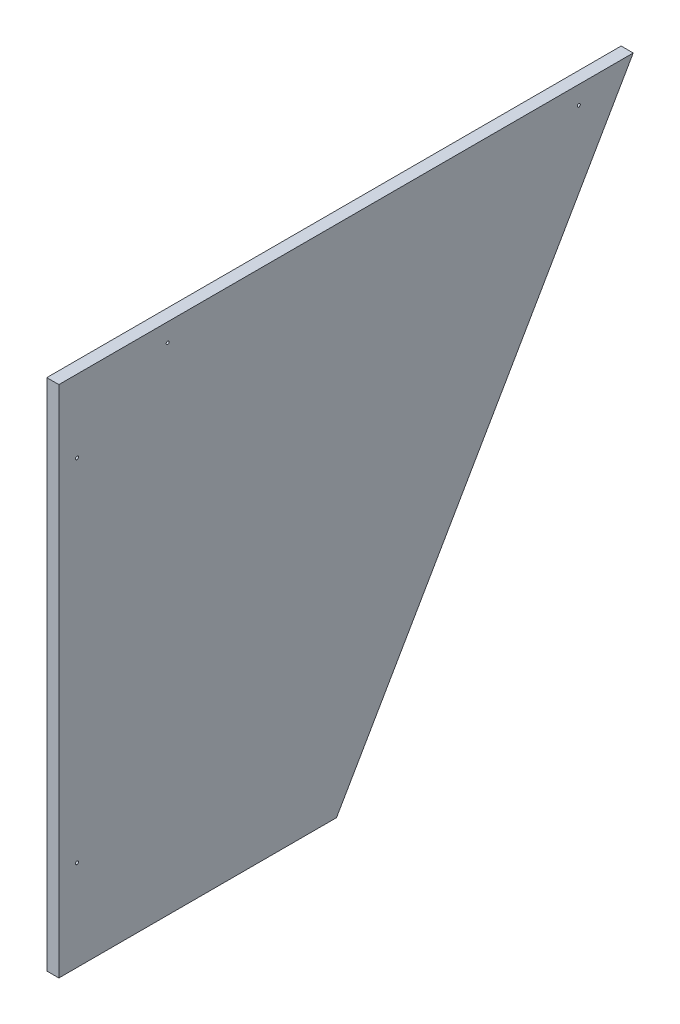
ISO-10303-21;
HEADER;
FILE_DESCRIPTION(('STEP AP214'),'2;1');
FILE_NAME('part.step','',(''),(''),'','','');
FILE_SCHEMA(('AUTOMOTIVE_DESIGN { 1 0 10303 214 1 1 1 1 }'));
ENDSEC;
DATA;
#1=APPLICATION_CONTEXT('core data for automotive mechanical design processes');
#2=APPLICATION_PROTOCOL_DEFINITION('international standard','automotive_design',2000,#1);
#3=PRODUCT_CONTEXT('',#1,'mechanical');
#4=PRODUCT('Part','Part','',(#3));
#5=PRODUCT_RELATED_PRODUCT_CATEGORY('part','',(#4));
#6=PRODUCT_DEFINITION_FORMATION('','',#4);
#7=PRODUCT_DEFINITION_CONTEXT('part definition',#1,'design');
#8=PRODUCT_DEFINITION('design','',#6,#7);
#9=PRODUCT_DEFINITION_SHAPE('','',#8);
#10=(LENGTH_UNIT() NAMED_UNIT(*) SI_UNIT(.MILLI.,.METRE.));
#11=(NAMED_UNIT(*) PLANE_ANGLE_UNIT() SI_UNIT($,.RADIAN.));
#12=(NAMED_UNIT(*) SI_UNIT($,.STERADIAN.) SOLID_ANGLE_UNIT());
#13=UNCERTAINTY_MEASURE_WITH_UNIT(LENGTH_MEASURE(1.E-05),#10,'distance_accuracy_value','');
#14=(GEOMETRIC_REPRESENTATION_CONTEXT(3) GLOBAL_UNCERTAINTY_ASSIGNED_CONTEXT((#13)) GLOBAL_UNIT_ASSIGNED_CONTEXT((#10,
#11,#12)) REPRESENTATION_CONTEXT('',''));
#15=CARTESIAN_POINT('',(0.,0.,0.));
#16=DIRECTION('',(0.,0.,1.));
#17=DIRECTION('',(1.,0.,0.));
#18=AXIS2_PLACEMENT_3D('',#15,#16,#17);
#19=CARTESIAN_POINT('',(-587.375,0.,0.));
#20=DIRECTION('',(1.,0.,0.));
#21=DIRECTION('',(0.,0.,-1.));
#22=AXIS2_PLACEMENT_3D('',#19,#20,#21);
#23=PLANE('',#22);
#24=CARTESIAN_POINT('',(-587.375,-406.4,1047.75));
#25=DIRECTION('',(-1.,0.,0.));
#26=DIRECTION('',(0.,0.,1.));
#27=AXIS2_PLACEMENT_3D('',#24,#25,#26);
#28=CIRCLE('',#27,1.5875);
#29=CARTESIAN_POINT('',(-587.375,-406.4,1049.3375));
#30=VERTEX_POINT('',#29);
#31=EDGE_CURVE('E91',#30,#30,#28,.T.);
#32=ORIENTED_EDGE('',*,*,#31,.T.);
#33=EDGE_LOOP('',(#32));
#34=FACE_BOUND('',#33,.T.);
#35=CARTESIAN_POINT('',(-587.375,-38.1,1047.75));
#36=DIRECTION('',(-1.,0.,0.));
#37=DIRECTION('',(0.,0.,1.));
#38=AXIS2_PLACEMENT_3D('',#35,#36,#37);
#39=CIRCLE('',#38,1.5875);
#40=CARTESIAN_POINT('',(-587.375,-38.1,1049.3375));
#41=VERTEX_POINT('',#40);
#42=EDGE_CURVE('E94',#41,#41,#39,.T.);
#43=ORIENTED_EDGE('',*,*,#42,.T.);
#44=EDGE_LOOP('',(#43));
#45=FACE_BOUND('',#44,.T.);
#46=CARTESIAN_POINT('',(-587.375,19.05,952.5));
#47=DIRECTION('',(-1.,0.,0.));
#48=DIRECTION('',(0.,0.,1.));
#49=AXIS2_PLACEMENT_3D('',#46,#47,#48);
#50=CIRCLE('',#49,1.5875);
#51=CARTESIAN_POINT('',(-587.375,19.05,954.0875));
#52=VERTEX_POINT('',#51);
#53=EDGE_CURVE('E96',#52,#52,#50,.T.);
#54=ORIENTED_EDGE('',*,*,#53,.T.);
#55=EDGE_LOOP('',(#54));
#56=FACE_BOUND('',#55,.T.);
#57=CARTESIAN_POINT('',(-587.375,19.05,520.7));
#58=DIRECTION('',(-1.,0.,0.));
#59=DIRECTION('',(0.,0.,1.));
#60=AXIS2_PLACEMENT_3D('',#57,#58,#59);
#61=CIRCLE('',#60,1.5875);
#62=CARTESIAN_POINT('',(-587.375,19.05,522.2875));
#63=VERTEX_POINT('',#62);
#64=EDGE_CURVE('E19',#63,#63,#61,.T.);
#65=ORIENTED_EDGE('',*,*,#64,.T.);
#66=EDGE_LOOP('',(#65));
#67=FACE_BOUND('',#66,.T.);
#68=DIRECTION('',(0.,-0.866025403784429,0.500000000000017));
#69=VECTOR('',#68,1.);
#70=CARTESIAN_POINT('',(-587.375,-501.65,775.174807795112));
#71=LINE('',#70,#69);
#72=CARTESIAN_POINT('',(-587.375,-501.65,775.174807795112));
#73=VERTEX_POINT('',#72);
#74=CARTESIAN_POINT('',(-587.375,38.0999999999997,463.549999999999));
#75=VERTEX_POINT('',#74);
#76=EDGE_CURVE('E70',#73,#75,#71,.F.);
#77=ORIENTED_EDGE('',*,*,#76,.T.);
#78=DIRECTION('',(0.,0.,-1.));
#79=VECTOR('',#78,1.);
#80=CARTESIAN_POINT('',(-587.375,38.1,463.55));
#81=LINE('',#80,#79);
#82=CARTESIAN_POINT('',(-587.375,38.1,1066.8));
#83=VERTEX_POINT('',#82);
#84=EDGE_CURVE('E67',#75,#83,#81,.F.);
#85=ORIENTED_EDGE('',*,*,#84,.T.);
#86=DIRECTION('',(0.,1.,0.));
#87=VECTOR('',#86,1.);
#88=CARTESIAN_POINT('',(-587.375,38.1,1066.8));
#89=LINE('',#88,#87);
#90=CARTESIAN_POINT('',(-587.375,-501.65,1066.8));
#91=VERTEX_POINT('',#90);
#92=EDGE_CURVE('E58',#83,#91,#89,.F.);
#93=ORIENTED_EDGE('',*,*,#92,.T.);
#94=DIRECTION('',(0.,0.,1.));
#95=VECTOR('',#94,1.);
#96=CARTESIAN_POINT('',(-587.375,-501.65,1066.8));
#97=LINE('',#96,#95);
#98=EDGE_CURVE('E53',#91,#73,#97,.F.);
#99=ORIENTED_EDGE('',*,*,#98,.T.);
#100=EDGE_LOOP('',(#77,#85,#93,#99));
#101=FACE_BOUND('',#100,.T.);
#102=ADVANCED_FACE('F16',(#34,#45,#56,#67,#101),#23,.T.);
#103=CARTESIAN_POINT('',(-587.375,38.1,463.55));
#104=DIRECTION('',(0.,-1.,0.));
#105=DIRECTION('',(0.,0.,-1.));
#106=AXIS2_PLACEMENT_3D('',#103,#104,#105);
#107=PLANE('',#106);
#108=DIRECTION('',(0.,0.,-1.));
#109=VECTOR('',#108,1.);
#110=CARTESIAN_POINT('',(-600.075,38.1,0.));
#111=LINE('',#110,#109);
#112=CARTESIAN_POINT('',(-600.075,38.0999999999998,463.549999999999));
#113=VERTEX_POINT('',#112);
#114=CARTESIAN_POINT('',(-600.075,38.1,1066.8));
#115=VERTEX_POINT('',#114);
#116=EDGE_CURVE('E77',#113,#115,#111,.F.);
#117=ORIENTED_EDGE('',*,*,#116,.T.);
#118=DIRECTION('',(-1.,0.,0.));
#119=VECTOR('',#118,1.);
#120=CARTESIAN_POINT('',(-587.375,38.1,1066.8));
#121=LINE('',#120,#119);
#122=EDGE_CURVE('E63',#115,#83,#121,.F.);
#123=ORIENTED_EDGE('',*,*,#122,.T.);
#124=ORIENTED_EDGE('',*,*,#84,.F.);
#125=DIRECTION('',(1.,0.,0.));
#126=VECTOR('',#125,1.);
#127=CARTESIAN_POINT('',(-587.375,38.0999999999989,463.549999999998));
#128=LINE('',#127,#126);
#129=EDGE_CURVE('E103',#75,#113,#128,.F.);
#130=ORIENTED_EDGE('',*,*,#129,.T.);
#131=EDGE_LOOP('',(#117,#123,#124,#130));
#132=FACE_BOUND('',#131,.T.);
#133=ADVANCED_FACE('F76',(#132),#107,.F.);
#134=CARTESIAN_POINT('',(-587.375,38.1,1066.8));
#135=DIRECTION('',(0.,0.,-1.));
#136=DIRECTION('',(-1.,0.,0.));
#137=AXIS2_PLACEMENT_3D('',#134,#135,#136);
#138=PLANE('',#137);
#139=DIRECTION('',(0.,1.,0.));
#140=VECTOR('',#139,1.);
#141=CARTESIAN_POINT('',(-600.075,0.,1066.8));
#142=LINE('',#141,#140);
#143=CARTESIAN_POINT('',(-600.075,-501.65,1066.8));
#144=VERTEX_POINT('',#143);
#145=EDGE_CURVE('E110',#115,#144,#142,.F.);
#146=ORIENTED_EDGE('',*,*,#145,.T.);
#147=DIRECTION('',(1.,0.,0.));
#148=VECTOR('',#147,1.);
#149=CARTESIAN_POINT('',(-587.375,-501.65,1066.8));
#150=LINE('',#149,#148);
#151=EDGE_CURVE('E65',#144,#91,#150,.T.);
#152=ORIENTED_EDGE('',*,*,#151,.T.);
#153=ORIENTED_EDGE('',*,*,#92,.F.);
#154=ORIENTED_EDGE('',*,*,#122,.F.);
#155=EDGE_LOOP('',(#146,#152,#153,#154));
#156=FACE_BOUND('',#155,.T.);
#157=ADVANCED_FACE('F61',(#156),#138,.F.);
#158=CARTESIAN_POINT('',(-587.375,-501.65,1066.8));
#159=DIRECTION('',(0.,1.,0.));
#160=DIRECTION('',(0.,0.,1.));
#161=AXIS2_PLACEMENT_3D('',#158,#159,#160);
#162=PLANE('',#161);
#163=DIRECTION('',(0.,0.,-1.));
#164=VECTOR('',#163,1.);
#165=CARTESIAN_POINT('',(-600.075,-501.65,0.));
#166=LINE('',#165,#164);
#167=CARTESIAN_POINT('',(-600.075,-501.65,775.174807795112));
#168=VERTEX_POINT('',#167);
#169=EDGE_CURVE('E112',#144,#168,#166,.T.);
#170=ORIENTED_EDGE('',*,*,#169,.T.);
#171=DIRECTION('',(1.,0.,0.));
#172=VECTOR('',#171,1.);
#173=CARTESIAN_POINT('',(-587.375,-501.65,775.174807795112));
#174=LINE('',#173,#172);
#175=EDGE_CURVE('E34',#168,#73,#174,.T.);
#176=ORIENTED_EDGE('',*,*,#175,.T.);
#177=ORIENTED_EDGE('',*,*,#98,.F.);
#178=ORIENTED_EDGE('',*,*,#151,.F.);
#179=EDGE_LOOP('',(#170,#176,#177,#178));
#180=FACE_BOUND('',#179,.T.);
#181=ADVANCED_FACE('F118',(#180),#162,.F.);
#182=CARTESIAN_POINT('',(-587.375,-501.65,775.174807795112));
#183=DIRECTION('',(0.,0.500000000000017,0.866025403784429));
#184=DIRECTION('',(0.,-0.866025403784429,0.500000000000017));
#185=AXIS2_PLACEMENT_3D('',#182,#183,#184);
#186=PLANE('',#185);
#187=DIRECTION('',(0.,0.866025403784431,-0.500000000000014));
#188=VECTOR('',#187,1.);
#189=CARTESIAN_POINT('',(-600.075,-501.65,775.174807795112));
#190=LINE('',#189,#188);
#191=EDGE_CURVE('E90',#168,#113,#190,.T.);
#192=ORIENTED_EDGE('',*,*,#191,.T.);
#193=ORIENTED_EDGE('',*,*,#129,.F.);
#194=ORIENTED_EDGE('',*,*,#76,.F.);
#195=ORIENTED_EDGE('',*,*,#175,.F.);
#196=EDGE_LOOP('',(#192,#193,#194,#195));
#197=FACE_BOUND('',#196,.T.);
#198=ADVANCED_FACE('F114',(#197),#186,.F.);
#199=CARTESIAN_POINT('',(-600.075,19.05,520.7));
#200=DIRECTION('',(-1.,0.,0.));
#201=DIRECTION('',(0.,0.,1.));
#202=AXIS2_PLACEMENT_3D('',#199,#200,#201);
#203=CYLINDRICAL_SURFACE('',#202,1.5875);
#204=CARTESIAN_POINT('',(-600.075,19.05,520.7));
#205=DIRECTION('',(-1.,0.,0.));
#206=DIRECTION('',(0.,0.,1.));
#207=AXIS2_PLACEMENT_3D('',#204,#205,#206);
#208=CIRCLE('',#207,1.5875);
#209=CARTESIAN_POINT('',(-600.075,19.05,522.2875));
#210=VERTEX_POINT('',#209);
#211=EDGE_CURVE('E87',#210,#210,#208,.T.);
#212=ORIENTED_EDGE('',*,*,#211,.T.);
#213=EDGE_LOOP('',(#212));
#214=FACE_BOUND('',#213,.T.);
#215=ORIENTED_EDGE('',*,*,#64,.F.);
#216=EDGE_LOOP('',(#215));
#217=FACE_BOUND('',#216,.T.);
#218=ADVANCED_FACE('F126',(#214,#217),#203,.F.);
#219=CARTESIAN_POINT('',(-600.075,19.05,952.5));
#220=DIRECTION('',(-1.,0.,0.));
#221=DIRECTION('',(0.,0.,1.));
#222=AXIS2_PLACEMENT_3D('',#219,#220,#221);
#223=CYLINDRICAL_SURFACE('',#222,1.5875);
#224=CARTESIAN_POINT('',(-600.075,19.05,952.5));
#225=DIRECTION('',(-1.,0.,0.));
#226=DIRECTION('',(0.,0.,1.));
#227=AXIS2_PLACEMENT_3D('',#224,#225,#226);
#228=CIRCLE('',#227,1.5875);
#229=CARTESIAN_POINT('',(-600.075,19.05,954.0875));
#230=VERTEX_POINT('',#229);
#231=EDGE_CURVE('E84',#230,#230,#228,.T.);
#232=ORIENTED_EDGE('',*,*,#231,.T.);
#233=EDGE_LOOP('',(#232));
#234=FACE_BOUND('',#233,.T.);
#235=ORIENTED_EDGE('',*,*,#53,.F.);
#236=EDGE_LOOP('',(#235));
#237=FACE_BOUND('',#236,.T.);
#238=ADVANCED_FACE('F144',(#234,#237),#223,.F.);
#239=CARTESIAN_POINT('',(-600.075,-38.1,1047.75));
#240=DIRECTION('',(-1.,0.,0.));
#241=DIRECTION('',(0.,0.,1.));
#242=AXIS2_PLACEMENT_3D('',#239,#240,#241);
#243=CYLINDRICAL_SURFACE('',#242,1.5875);
#244=CARTESIAN_POINT('',(-600.075,-38.1,1047.75));
#245=DIRECTION('',(-1.,0.,0.));
#246=DIRECTION('',(0.,0.,1.));
#247=AXIS2_PLACEMENT_3D('',#244,#245,#246);
#248=CIRCLE('',#247,1.5875);
#249=CARTESIAN_POINT('',(-600.075,-38.1,1049.3375));
#250=VERTEX_POINT('',#249);
#251=EDGE_CURVE('E25',#250,#250,#248,.T.);
#252=ORIENTED_EDGE('',*,*,#251,.T.);
#253=EDGE_LOOP('',(#252));
#254=FACE_BOUND('',#253,.T.);
#255=ORIENTED_EDGE('',*,*,#42,.F.);
#256=EDGE_LOOP('',(#255));
#257=FACE_BOUND('',#256,.T.);
#258=ADVANCED_FACE('F136',(#254,#257),#243,.F.);
#259=CARTESIAN_POINT('',(-600.075,-406.4,1047.75));
#260=DIRECTION('',(-1.,0.,0.));
#261=DIRECTION('',(0.,0.,1.));
#262=AXIS2_PLACEMENT_3D('',#259,#260,#261);
#263=CYLINDRICAL_SURFACE('',#262,1.5875);
#264=CARTESIAN_POINT('',(-600.075,-406.4,1047.75));
#265=DIRECTION('',(-1.,0.,0.));
#266=DIRECTION('',(0.,0.,1.));
#267=AXIS2_PLACEMENT_3D('',#264,#265,#266);
#268=CIRCLE('',#267,1.5875);
#269=CARTESIAN_POINT('',(-600.075,-406.4,1049.3375));
#270=VERTEX_POINT('',#269);
#271=EDGE_CURVE('E11',#270,#270,#268,.T.);
#272=ORIENTED_EDGE('',*,*,#271,.T.);
#273=EDGE_LOOP('',(#272));
#274=FACE_BOUND('',#273,.T.);
#275=ORIENTED_EDGE('',*,*,#31,.F.);
#276=EDGE_LOOP('',(#275));
#277=FACE_BOUND('',#276,.T.);
#278=ADVANCED_FACE('F130',(#274,#277),#263,.F.);
#279=CARTESIAN_POINT('',(-600.075,0.,0.));
#280=DIRECTION('',(1.,0.,0.));
#281=DIRECTION('',(0.,0.,-1.));
#282=AXIS2_PLACEMENT_3D('',#279,#280,#281);
#283=PLANE('',#282);
#284=ORIENTED_EDGE('',*,*,#271,.F.);
#285=EDGE_LOOP('',(#284));
#286=FACE_BOUND('',#285,.T.);
#287=ORIENTED_EDGE('',*,*,#251,.F.);
#288=EDGE_LOOP('',(#287));
#289=FACE_BOUND('',#288,.T.);
#290=ORIENTED_EDGE('',*,*,#231,.F.);
#291=EDGE_LOOP('',(#290));
#292=FACE_BOUND('',#291,.T.);
#293=ORIENTED_EDGE('',*,*,#211,.F.);
#294=EDGE_LOOP('',(#293));
#295=FACE_BOUND('',#294,.T.);
#296=ORIENTED_EDGE('',*,*,#169,.F.);
#297=ORIENTED_EDGE('',*,*,#145,.F.);
#298=ORIENTED_EDGE('',*,*,#116,.F.);
#299=ORIENTED_EDGE('',*,*,#191,.F.);
#300=EDGE_LOOP('',(#296,#297,#298,#299));
#301=FACE_BOUND('',#300,.T.);
#302=ADVANCED_FACE('F117',(#286,#289,#292,#295,#301),#283,.F.);
#303=CLOSED_SHELL('',(#102,#133,#157,#181,#198,#218,#238,#258,#278,#302));
#304=MANIFOLD_SOLID_BREP('B1',#303);
#305=ADVANCED_BREP_SHAPE_REPRESENTATION('',(#18,#304),#14);
#306=SHAPE_DEFINITION_REPRESENTATION(#9,#305);
ENDSEC;
END-ISO-10303-21;
